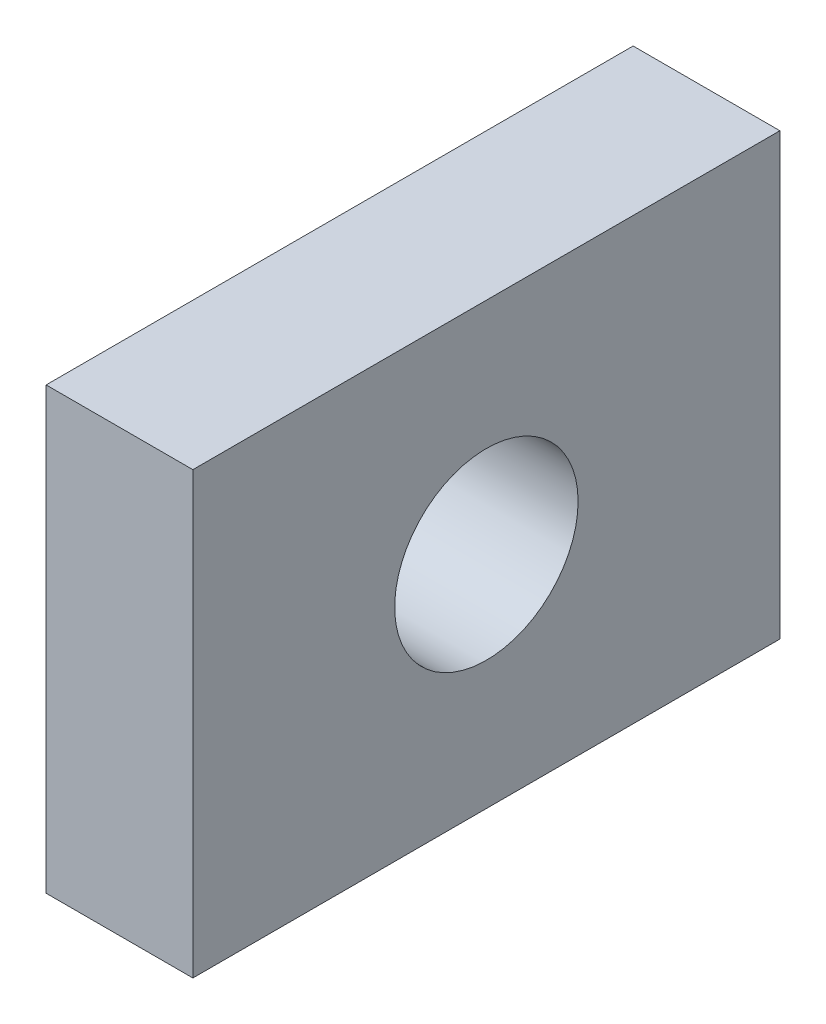
ISO-10303-21;
HEADER;
FILE_DESCRIPTION(('STEP AP214'),'2;1');
FILE_NAME('part.step','',(''),(''),'','','');
FILE_SCHEMA(('AUTOMOTIVE_DESIGN { 1 0 10303 214 1 1 1 1 }'));
ENDSEC;
DATA;
#1=APPLICATION_CONTEXT('core data for automotive mechanical design processes');
#2=APPLICATION_PROTOCOL_DEFINITION('international standard','automotive_design',2000,#1);
#3=PRODUCT_CONTEXT('',#1,'mechanical');
#4=PRODUCT('Part','Part','',(#3));
#5=PRODUCT_RELATED_PRODUCT_CATEGORY('part','',(#4));
#6=PRODUCT_DEFINITION_FORMATION('','',#4);
#7=PRODUCT_DEFINITION_CONTEXT('part definition',#1,'design');
#8=PRODUCT_DEFINITION('design','',#6,#7);
#9=PRODUCT_DEFINITION_SHAPE('','',#8);
#10=(LENGTH_UNIT() NAMED_UNIT(*) SI_UNIT(.MILLI.,.METRE.));
#11=(NAMED_UNIT(*) PLANE_ANGLE_UNIT() SI_UNIT($,.RADIAN.));
#12=(NAMED_UNIT(*) SI_UNIT($,.STERADIAN.) SOLID_ANGLE_UNIT());
#13=UNCERTAINTY_MEASURE_WITH_UNIT(LENGTH_MEASURE(1.E-05),#10,'distance_accuracy_value','');
#14=(GEOMETRIC_REPRESENTATION_CONTEXT(3) GLOBAL_UNCERTAINTY_ASSIGNED_CONTEXT((#13)) GLOBAL_UNIT_ASSIGNED_CONTEXT((#10,
#11,#12)) REPRESENTATION_CONTEXT('',''));
#15=CARTESIAN_POINT('',(0.,0.,0.));
#16=DIRECTION('',(0.,0.,1.));
#17=DIRECTION('',(1.,0.,0.));
#18=AXIS2_PLACEMENT_3D('',#15,#16,#17);
#19=CARTESIAN_POINT('',(25.4,0.,0.));
#20=DIRECTION('',(-1.,0.,0.));
#21=DIRECTION('',(0.,0.,1.));
#22=AXIS2_PLACEMENT_3D('',#19,#20,#21);
#23=PLANE('',#22);
#24=DIRECTION('',(0.,-1.,0.));
#25=VECTOR('',#24,1.);
#26=CARTESIAN_POINT('',(25.4,-38.1,50.8));
#27=LINE('',#26,#25);
#28=CARTESIAN_POINT('',(25.4,38.1,50.8));
#29=VERTEX_POINT('',#28);
#30=CARTESIAN_POINT('',(25.4,-38.1,50.8));
#31=VERTEX_POINT('',#30);
#32=EDGE_CURVE('E91',#29,#31,#27,.T.);
#33=ORIENTED_EDGE('',*,*,#32,.T.);
#34=DIRECTION('',(0.,0.,-1.));
#35=VECTOR('',#34,1.);
#36=CARTESIAN_POINT('',(25.4,-38.1,50.8));
#37=LINE('',#36,#35);
#38=CARTESIAN_POINT('',(25.4,-38.1,-50.8));
#39=VERTEX_POINT('',#38);
#40=EDGE_CURVE('E86',#31,#39,#37,.T.);
#41=ORIENTED_EDGE('',*,*,#40,.T.);
#42=DIRECTION('',(0.,1.,0.));
#43=VECTOR('',#42,1.);
#44=CARTESIAN_POINT('',(25.4,-38.1,-50.8));
#45=LINE('',#44,#43);
#46=CARTESIAN_POINT('',(25.4,38.1,-50.8));
#47=VERTEX_POINT('',#46);
#48=EDGE_CURVE('E89',#39,#47,#45,.T.);
#49=ORIENTED_EDGE('',*,*,#48,.T.);
#50=DIRECTION('',(0.,0.,1.));
#51=VECTOR('',#50,1.);
#52=CARTESIAN_POINT('',(25.4,38.1,50.8));
#53=LINE('',#52,#51);
#54=EDGE_CURVE('E56',#47,#29,#53,.T.);
#55=ORIENTED_EDGE('',*,*,#54,.T.);
#56=EDGE_LOOP('',(#33,#41,#49,#55));
#57=FACE_BOUND('',#56,.T.);
#58=CARTESIAN_POINT('',(25.4,0.,0.));
#59=DIRECTION('',(1.,0.,0.));
#60=DIRECTION('',(0.,0.,-1.));
#61=AXIS2_PLACEMENT_3D('',#58,#59,#60);
#62=CIRCLE('',#61,15.875);
#63=CARTESIAN_POINT('',(25.4,0.,-15.875));
#64=VERTEX_POINT('',#63);
#65=EDGE_CURVE('E106',#64,#64,#62,.T.);
#66=ORIENTED_EDGE('',*,*,#65,.F.);
#67=EDGE_LOOP('',(#66));
#68=FACE_BOUND('',#67,.T.);
#69=ADVANCED_FACE('F39',(#57,#68),#23,.F.);
#70=CARTESIAN_POINT('',(0.,0.,0.));
#71=DIRECTION('',(-1.,0.,0.));
#72=DIRECTION('',(0.,0.,1.));
#73=AXIS2_PLACEMENT_3D('',#70,#71,#72);
#74=PLANE('',#73);
#75=DIRECTION('',(0.,-1.,0.));
#76=VECTOR('',#75,1.);
#77=CARTESIAN_POINT('',(0.,-38.1,50.8));
#78=LINE('',#77,#76);
#79=CARTESIAN_POINT('',(0.,38.1,50.8));
#80=VERTEX_POINT('',#79);
#81=CARTESIAN_POINT('',(0.,-38.1,50.8));
#82=VERTEX_POINT('',#81);
#83=EDGE_CURVE('E103',#80,#82,#78,.T.);
#84=ORIENTED_EDGE('',*,*,#83,.F.);
#85=DIRECTION('',(0.,0.,1.));
#86=VECTOR('',#85,1.);
#87=CARTESIAN_POINT('',(0.,38.1,50.8));
#88=LINE('',#87,#86);
#89=CARTESIAN_POINT('',(0.,38.1,-50.8));
#90=VERTEX_POINT('',#89);
#91=EDGE_CURVE('E79',#90,#80,#88,.T.);
#92=ORIENTED_EDGE('',*,*,#91,.F.);
#93=DIRECTION('',(0.,1.,0.));
#94=VECTOR('',#93,1.);
#95=CARTESIAN_POINT('',(0.,-38.1,-50.8));
#96=LINE('',#95,#94);
#97=CARTESIAN_POINT('',(0.,-38.1,-50.8));
#98=VERTEX_POINT('',#97);
#99=EDGE_CURVE('E73',#98,#90,#96,.T.);
#100=ORIENTED_EDGE('',*,*,#99,.F.);
#101=DIRECTION('',(0.,0.,-1.));
#102=VECTOR('',#101,1.);
#103=CARTESIAN_POINT('',(0.,-38.1,50.8));
#104=LINE('',#103,#102);
#105=EDGE_CURVE('E95',#82,#98,#104,.T.);
#106=ORIENTED_EDGE('',*,*,#105,.F.);
#107=EDGE_LOOP('',(#84,#92,#100,#106));
#108=FACE_BOUND('',#107,.T.);
#109=CARTESIAN_POINT('',(0.,0.,0.));
#110=DIRECTION('',(1.,0.,0.));
#111=DIRECTION('',(0.,0.,-1.));
#112=AXIS2_PLACEMENT_3D('',#109,#110,#111);
#113=CIRCLE('',#112,15.875);
#114=CARTESIAN_POINT('',(0.,0.,-15.875));
#115=VERTEX_POINT('',#114);
#116=EDGE_CURVE('E118',#115,#115,#113,.T.);
#117=ORIENTED_EDGE('',*,*,#116,.T.);
#118=EDGE_LOOP('',(#117));
#119=FACE_BOUND('',#118,.T.);
#120=ADVANCED_FACE('F114',(#108,#119),#74,.T.);
#121=CARTESIAN_POINT('',(25.4,-38.1,50.8));
#122=DIRECTION('',(0.,0.,-1.));
#123=DIRECTION('',(-1.,0.,0.));
#124=AXIS2_PLACEMENT_3D('',#121,#122,#123);
#125=PLANE('',#124);
#126=ORIENTED_EDGE('',*,*,#83,.T.);
#127=DIRECTION('',(-1.,0.,0.));
#128=VECTOR('',#127,1.);
#129=CARTESIAN_POINT('',(25.4,-38.1,50.8));
#130=LINE('',#129,#128);
#131=EDGE_CURVE('E11',#31,#82,#130,.T.);
#132=ORIENTED_EDGE('',*,*,#131,.F.);
#133=ORIENTED_EDGE('',*,*,#32,.F.);
#134=DIRECTION('',(-1.,0.,0.));
#135=VECTOR('',#134,1.);
#136=CARTESIAN_POINT('',(25.4,38.1,50.8));
#137=LINE('',#136,#135);
#138=EDGE_CURVE('E99',#29,#80,#137,.T.);
#139=ORIENTED_EDGE('',*,*,#138,.T.);
#140=EDGE_LOOP('',(#126,#132,#133,#139));
#141=FACE_BOUND('',#140,.T.);
#142=ADVANCED_FACE('F41',(#141),#125,.F.);
#143=CARTESIAN_POINT('',(25.4,-38.1,50.8));
#144=DIRECTION('',(0.,1.,0.));
#145=DIRECTION('',(0.,0.,1.));
#146=AXIS2_PLACEMENT_3D('',#143,#144,#145);
#147=PLANE('',#146);
#148=ORIENTED_EDGE('',*,*,#105,.T.);
#149=DIRECTION('',(-1.,0.,0.));
#150=VECTOR('',#149,1.);
#151=CARTESIAN_POINT('',(25.4,-38.1,-50.8));
#152=LINE('',#151,#150);
#153=EDGE_CURVE('E48',#39,#98,#152,.T.);
#154=ORIENTED_EDGE('',*,*,#153,.F.);
#155=ORIENTED_EDGE('',*,*,#40,.F.);
#156=ORIENTED_EDGE('',*,*,#131,.T.);
#157=EDGE_LOOP('',(#148,#154,#155,#156));
#158=FACE_BOUND('',#157,.T.);
#159=ADVANCED_FACE('F94',(#158),#147,.F.);
#160=CARTESIAN_POINT('',(25.4,-38.1,-50.8));
#161=DIRECTION('',(0.,0.,1.));
#162=DIRECTION('',(1.,0.,0.));
#163=AXIS2_PLACEMENT_3D('',#160,#161,#162);
#164=PLANE('',#163);
#165=ORIENTED_EDGE('',*,*,#99,.T.);
#166=DIRECTION('',(-1.,0.,0.));
#167=VECTOR('',#166,1.);
#168=CARTESIAN_POINT('',(25.4,38.1,-50.8));
#169=LINE('',#168,#167);
#170=EDGE_CURVE('E96',#47,#90,#169,.T.);
#171=ORIENTED_EDGE('',*,*,#170,.F.);
#172=ORIENTED_EDGE('',*,*,#48,.F.);
#173=ORIENTED_EDGE('',*,*,#153,.T.);
#174=EDGE_LOOP('',(#165,#171,#172,#173));
#175=FACE_BOUND('',#174,.T.);
#176=ADVANCED_FACE('F97',(#175),#164,.F.);
#177=CARTESIAN_POINT('',(25.4,38.1,50.8));
#178=DIRECTION('',(0.,-1.,0.));
#179=DIRECTION('',(0.,0.,-1.));
#180=AXIS2_PLACEMENT_3D('',#177,#178,#179);
#181=PLANE('',#180);
#182=ORIENTED_EDGE('',*,*,#91,.T.);
#183=ORIENTED_EDGE('',*,*,#138,.F.);
#184=ORIENTED_EDGE('',*,*,#54,.F.);
#185=ORIENTED_EDGE('',*,*,#170,.T.);
#186=EDGE_LOOP('',(#182,#183,#184,#185));
#187=FACE_BOUND('',#186,.T.);
#188=ADVANCED_FACE('F111',(#187),#181,.F.);
#189=CARTESIAN_POINT('',(25.4,0.,0.));
#190=DIRECTION('',(-1.,0.,0.));
#191=DIRECTION('',(0.,0.,1.));
#192=AXIS2_PLACEMENT_3D('',#189,#190,#191);
#193=CYLINDRICAL_SURFACE('',#192,15.875);
#194=ORIENTED_EDGE('',*,*,#65,.T.);
#195=EDGE_LOOP('',(#194));
#196=FACE_BOUND('',#195,.T.);
#197=ORIENTED_EDGE('',*,*,#116,.F.);
#198=EDGE_LOOP('',(#197));
#199=FACE_BOUND('',#198,.T.);
#200=ADVANCED_FACE('F124',(#196,#199),#193,.F.);
#201=CLOSED_SHELL('',(#69,#120,#142,#159,#176,#188,#200));
#202=MANIFOLD_SOLID_BREP('B2',#201);
#203=ADVANCED_BREP_SHAPE_REPRESENTATION('',(#18,#202),#14);
#204=SHAPE_DEFINITION_REPRESENTATION(#9,#203);
ENDSEC;
END-ISO-10303-21;
